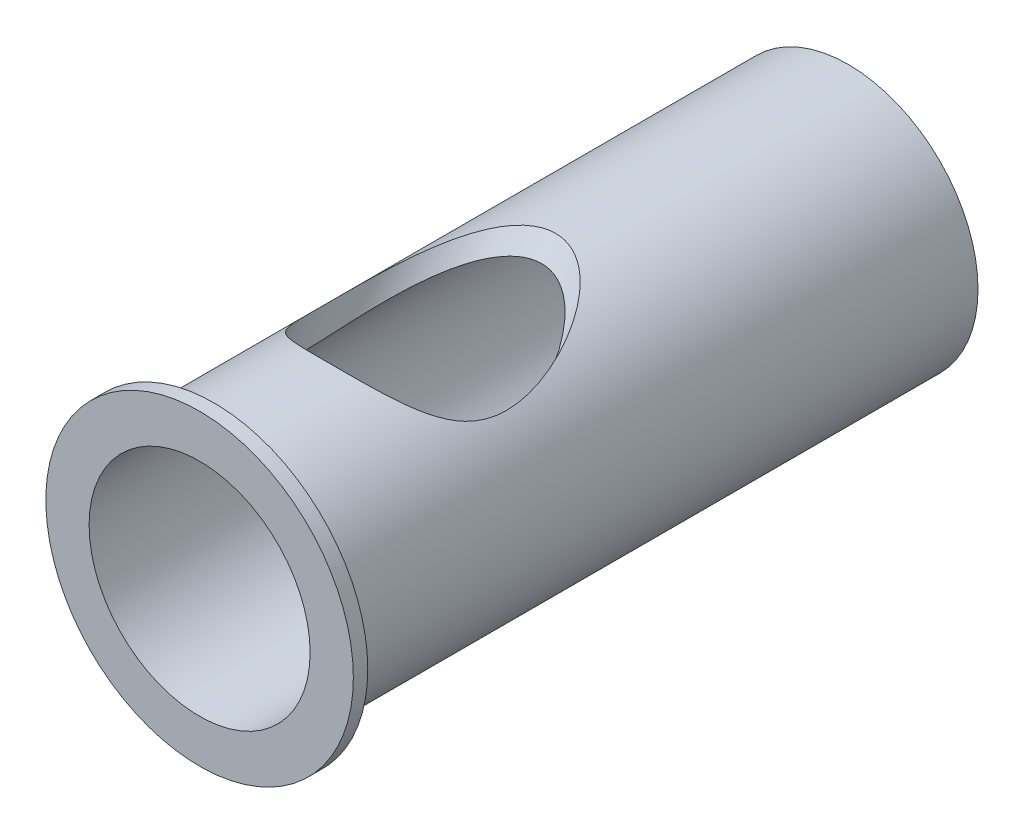
ISO-10303-21;
HEADER;
FILE_DESCRIPTION(('STEP AP214'),'2;1');
FILE_NAME('part.step','',(''),(''),'','','');
FILE_SCHEMA(('AUTOMOTIVE_DESIGN { 1 0 10303 214 1 1 1 1 }'));
ENDSEC;
DATA;
#1=APPLICATION_CONTEXT('core data for automotive mechanical design processes');
#2=APPLICATION_PROTOCOL_DEFINITION('international standard','automotive_design',2000,#1);
#3=PRODUCT_CONTEXT('',#1,'mechanical');
#4=PRODUCT('Part','Part','',(#3));
#5=PRODUCT_RELATED_PRODUCT_CATEGORY('part','',(#4));
#6=PRODUCT_DEFINITION_FORMATION('','',#4);
#7=PRODUCT_DEFINITION_CONTEXT('part definition',#1,'design');
#8=PRODUCT_DEFINITION('design','',#6,#7);
#9=PRODUCT_DEFINITION_SHAPE('','',#8);
#10=(LENGTH_UNIT() NAMED_UNIT(*) SI_UNIT(.MILLI.,.METRE.));
#11=(NAMED_UNIT(*) PLANE_ANGLE_UNIT() SI_UNIT($,.RADIAN.));
#12=(NAMED_UNIT(*) SI_UNIT($,.STERADIAN.) SOLID_ANGLE_UNIT());
#13=UNCERTAINTY_MEASURE_WITH_UNIT(LENGTH_MEASURE(1.E-05),#10,'distance_accuracy_value','');
#14=(GEOMETRIC_REPRESENTATION_CONTEXT(3) GLOBAL_UNCERTAINTY_ASSIGNED_CONTEXT((#13)) GLOBAL_UNIT_ASSIGNED_CONTEXT((#10,
#11,#12)) REPRESENTATION_CONTEXT('',''));
#15=CARTESIAN_POINT('',(0.,0.,0.));
#16=DIRECTION('',(0.,0.,1.));
#17=DIRECTION('',(1.,0.,0.));
#18=AXIS2_PLACEMENT_3D('',#15,#16,#17);
#19=CARTESIAN_POINT('',(0.,0.,0.));
#20=DIRECTION('',(0.,0.,1.));
#21=DIRECTION('',(1.,0.,0.));
#22=AXIS2_PLACEMENT_3D('',#19,#20,#21);
#23=PLANE('',#22);
#24=CARTESIAN_POINT('',(0.,0.,0.));
#25=DIRECTION('',(0.,0.,1.));
#26=DIRECTION('',(1.,0.,0.));
#27=AXIS2_PLACEMENT_3D('',#24,#25,#26);
#28=CIRCLE('',#27,8.);
#29=CARTESIAN_POINT('',(8.,0.,0.));
#30=VERTEX_POINT('',#29);
#31=EDGE_CURVE('E45',#30,#30,#28,.T.);
#32=ORIENTED_EDGE('',*,*,#31,.F.);
#33=EDGE_LOOP('',(#32));
#34=FACE_BOUND('',#33,.T.);
#35=CARTESIAN_POINT('',(0.,0.,0.));
#36=DIRECTION('',(0.,0.,1.));
#37=DIRECTION('',(1.,0.,0.));
#38=AXIS2_PLACEMENT_3D('',#35,#36,#37);
#39=CIRCLE('',#38,6.75);
#40=CARTESIAN_POINT('',(6.75,0.,0.));
#41=VERTEX_POINT('',#40);
#42=EDGE_CURVE('E10',#41,#41,#39,.F.);
#43=ORIENTED_EDGE('',*,*,#42,.F.);
#44=EDGE_LOOP('',(#43));
#45=FACE_BOUND('',#44,.T.);
#46=ADVANCED_FACE('F29',(#34,#45),#23,.F.);
#47=CARTESIAN_POINT('',(0.,0.,0.75));
#48=DIRECTION('',(0.,0.,1.));
#49=DIRECTION('',(1.,0.,0.));
#50=AXIS2_PLACEMENT_3D('',#47,#48,#49);
#51=PLANE('',#50);
#52=CARTESIAN_POINT('',(0.,0.,0.75));
#53=DIRECTION('',(0.,0.,1.));
#54=DIRECTION('',(1.,0.,0.));
#55=AXIS2_PLACEMENT_3D('',#52,#53,#54);
#56=CIRCLE('',#55,8.);
#57=CARTESIAN_POINT('',(8.,0.,0.75));
#58=VERTEX_POINT('',#57);
#59=EDGE_CURVE('E41',#58,#58,#56,.T.);
#60=ORIENTED_EDGE('',*,*,#59,.T.);
#61=EDGE_LOOP('',(#60));
#62=FACE_BOUND('',#61,.T.);
#63=CARTESIAN_POINT('',(0.,0.,0.75));
#64=DIRECTION('',(0.,0.,1.));
#65=DIRECTION('',(1.,0.,0.));
#66=AXIS2_PLACEMENT_3D('',#63,#64,#65);
#67=CIRCLE('',#66,5.75);
#68=CARTESIAN_POINT('',(5.75,0.,0.75));
#69=VERTEX_POINT('',#68);
#70=EDGE_CURVE('E49',#69,#69,#67,.T.);
#71=ORIENTED_EDGE('',*,*,#70,.F.);
#72=EDGE_LOOP('',(#71));
#73=FACE_BOUND('',#72,.T.);
#74=ADVANCED_FACE('F83',(#62,#73),#51,.T.);
#75=CARTESIAN_POINT('',(0.,0.,0.75));
#76=DIRECTION('',(0.,0.,-1.));
#77=DIRECTION('',(-1.,0.,0.));
#78=AXIS2_PLACEMENT_3D('',#75,#76,#77);
#79=CYLINDRICAL_SURFACE('',#78,8.);
#80=ORIENTED_EDGE('',*,*,#59,.F.);
#81=EDGE_LOOP('',(#80));
#82=FACE_BOUND('',#81,.T.);
#83=ORIENTED_EDGE('',*,*,#31,.T.);
#84=EDGE_LOOP('',(#83));
#85=FACE_BOUND('',#84,.T.);
#86=ADVANCED_FACE('F31',(#82,#85),#79,.T.);
#87=CARTESIAN_POINT('',(0.,0.,0.75));
#88=DIRECTION('',(0.,0.,-1.));
#89=DIRECTION('',(-1.,0.,0.));
#90=AXIS2_PLACEMENT_3D('',#87,#88,#89);
#91=CYLINDRICAL_SURFACE('',#90,5.75);
#92=CARTESIAN_POINT('',(0.,5.75,-5.30629664290703));
#93=CARTESIAN_POINT('',(0.130680412431029,5.75000288558465,-5.30629572991546));
#94=CARTESIAN_POINT('',(0.261331233982429,5.74554114326279,-5.30972559956274));
#95=CARTESIAN_POINT('',(0.52170846593303,5.72776913861366,-5.32343374443545));
#96=CARTESIAN_POINT('',(0.651434691685461,5.71445715626851,-5.33371335088777));
#97=CARTESIAN_POINT('',(0.909038175413375,5.67917810389533,-5.36110145547959));
#98=CARTESIAN_POINT('',(1.03691444044914,5.6572065525103,-5.37821348948404));
#99=CARTESIAN_POINT('',(1.28989545146572,5.60494047762857,-5.41923366483618));
#100=CARTESIAN_POINT('',(1.41499911588225,5.57464276585176,-5.4431444096899));
#101=CARTESIAN_POINT('',(1.66122264238964,5.50628047140044,-5.4976518479393));
#102=CARTESIAN_POINT('',(1.78235158450518,5.46823526545043,-5.52823187453841));
#103=CARTESIAN_POINT('',(2.02021637369789,5.38489685972274,-5.5961034203329));
#104=CARTESIAN_POINT('',(2.13695020177727,5.33960037789276,-5.63339797959878));
#105=CARTESIAN_POINT('',(2.36529214235244,5.2424511188252,-5.71471703775265));
#106=CARTESIAN_POINT('',(2.47689805363255,5.19059556122124,-5.75874439230992));
#107=CARTESIAN_POINT('',(2.69422193368248,5.0811870532787,-5.85356338597342));
#108=CARTESIAN_POINT('',(2.79994233049067,5.02363648001691,-5.90435220590232));
#109=CARTESIAN_POINT('',(3.00793300534078,4.90201694767191,-6.01443992883657));
#110=CARTESIAN_POINT('',(3.11001205655151,4.83780660958394,-6.07394421851287));
#111=CARTESIAN_POINT('',(3.30666813153573,4.70557933927185,-6.20052920839255));
#112=CARTESIAN_POINT('',(3.40124811282812,4.63756392594397,-6.26760689620819));
#113=CARTESIAN_POINT('',(3.58230964182943,4.49917078009174,-6.40973506064474));
#114=CARTESIAN_POINT('',(3.66879306762416,4.4287936005762,-6.48478367965561));
#115=CARTESIAN_POINT('',(3.83302695209899,4.28743817721743,-6.64337101816204));
#116=CARTESIAN_POINT('',(3.91078066639039,4.21646016813538,-6.72690655030619));
#117=CARTESIAN_POINT('',(4.03597383346852,4.09617610133763,-6.87782996839516));
#118=CARTESIAN_POINT('',(4.0857219246373,4.04647931685547,-6.94300031075999));
#119=CARTESIAN_POINT('',(4.18016023598269,3.94884382293843,-7.07813473047429));
#120=CARTESIAN_POINT('',(4.22485188403518,3.90090461978247,-7.14809744551377));
#121=CARTESIAN_POINT('',(4.30885176890441,3.80791513214527,-7.29280334242662));
#122=CARTESIAN_POINT('',(4.34816922806994,3.7628599710216,-7.36753800357677));
#123=CARTESIAN_POINT('',(4.42125781159588,3.6767065083357,-7.5218034999211));
#124=CARTESIAN_POINT('',(4.45503185990169,3.63560612553769,-7.6013317761956));
#125=CARTESIAN_POINT('',(4.51719720216576,3.5580790197996,-7.76574225129305));
#126=CARTESIAN_POINT('',(4.54553240052937,3.52170213750884,-7.85066934400973));
#127=CARTESIAN_POINT('',(4.59636267749919,3.45509902051374,-8.02458508512187));
#128=CARTESIAN_POINT('',(4.61885821717372,3.42487230026614,-8.11357341221118));
#129=CARTESIAN_POINT('',(4.65815186527345,3.37123569845208,-8.29480062661039));
#130=CARTESIAN_POINT('',(4.67494992189361,3.34782587886938,-8.38703954346824));
#131=CARTESIAN_POINT('',(4.70317477196393,3.30805702767188,-8.57383583467173));
#132=CARTESIAN_POINT('',(4.71460025927121,3.29169971069425,-8.66839376692803));
#133=CARTESIAN_POINT('',(4.73384615981668,3.26397469588583,-8.87280217180147));
#134=CARTESIAN_POINT('',(4.74089667974343,3.25368416460023,-8.98286974634207));
#135=CARTESIAN_POINT('',(4.7493345415213,3.24135327677586,-9.2036639522311));
#136=CARTESIAN_POINT('',(4.75072041920688,3.23931505324946,-9.31439074656556));
#137=CARTESIAN_POINT('',(4.74859374875228,3.24243087836585,-9.53597156849909));
#138=CARTESIAN_POINT('',(4.74506763389541,3.24760484680504,-9.64682510018232));
#139=CARTESIAN_POINT('',(4.7337521956935,3.26407501600456,-9.8678725084329));
#140=CARTESIAN_POINT('',(4.72596103507189,3.27537385518772,-9.97806608001));
#141=CARTESIAN_POINT('',(4.69762700083368,3.31600259940603,-10.3002217865313));
#142=CARTESIAN_POINT('',(4.67197507335949,3.35230944684711,-10.5108567425406));
#143=CARTESIAN_POINT('',(4.60931128875608,3.43795736909389,-10.9277640389658));
#144=CARTESIAN_POINT('',(4.57228754742909,3.48731207210589,-11.1340315729747));
#145=CARTESIAN_POINT('',(4.48802458947355,3.59511294126111,-11.5427287772699));
#146=CARTESIAN_POINT('',(4.44075390531911,3.65358695331231,-11.7451444882925));
#147=CARTESIAN_POINT('',(4.33659661346578,3.77662958992441,-12.1454625108723));
#148=CARTESIAN_POINT('',(4.27971415587862,3.8411955788384,-12.3433667286963));
#149=CARTESIAN_POINT('',(4.14565473621482,3.98589883432853,-12.7685059600345));
#150=CARTESIAN_POINT('',(4.06666959276473,4.06680102467571,-12.994912346085));
#151=CARTESIAN_POINT('',(3.89469657238967,4.23179215758126,-13.4412856198576));
#152=CARTESIAN_POINT('',(3.80170281120609,4.31588242811844,-13.6612497549443));
#153=CARTESIAN_POINT('',(3.60080058472556,4.48485297561016,-14.0927010659054));
#154=CARTESIAN_POINT('',(3.49295776536348,4.56972832060321,-14.3042205388836));
#155=CARTESIAN_POINT('',(3.26012317796769,4.73864950441791,-14.7178196352207));
#156=CARTESIAN_POINT('',(3.13514549256885,4.82269596429113,-14.9199068297288));
#157=CARTESIAN_POINT('',(2.88426715262977,4.97613923485673,-15.2840243113633));
#158=CARTESIAN_POINT('',(2.7609889104478,5.04592881595251,-15.4476813661887));
#159=CARTESIAN_POINT('',(2.49721844902559,5.18154669950428,-15.7629024491151));
#160=CARTESIAN_POINT('',(2.35670454881337,5.24736985415113,-15.9144508417453));
#161=CARTESIAN_POINT('',(2.05449655274468,5.37295541302685,-16.2016428769961));
#162=CARTESIAN_POINT('',(1.89259999625098,5.43264872784017,-16.3371074425726));
#163=CARTESIAN_POINT('',(1.54670121270095,5.54101102705591,-16.5818157266376));
#164=CARTESIAN_POINT('',(1.36276386646168,5.58971120783031,-16.6911336980347));
#165=CARTESIAN_POINT('',(1.03994209659998,5.65669257063893,-16.841042413154));
#166=CARTESIAN_POINT('',(0.907056619760613,5.67968463951215,-16.892359443651));
#167=CARTESIAN_POINT('',(0.633911523844421,5.71660499093457,-16.974664335593));
#168=CARTESIAN_POINT('',(0.493660535602266,5.73054363689651,-17.0056754414707));
#169=CARTESIAN_POINT('',(0.208382489289948,5.7480074888,-17.0445181363331));
#170=CARTESIAN_POINT('',(0.0633315604899354,5.75146880785028,-17.0522075185742));
#171=CARTESIAN_POINT('',(-0.225856681648289,5.74738268212758,-17.0431243511025));
#172=CARTESIAN_POINT('',(-0.369993812889518,5.73983310837626,-17.0263470707112));
#173=CARTESIAN_POINT('',(-0.642265112413987,5.71553387457657,-16.9722653440582));
#174=CARTESIAN_POINT('',(-0.770794973236055,5.6995048694623,-16.9365684509106));
#175=CARTESIAN_POINT('',(-1.02078570947491,5.6600830933449,-16.8485957812161));
#176=CARTESIAN_POINT('',(-1.14224307340166,5.63668670076058,-16.7963118508969));
#177=CARTESIAN_POINT('',(-1.44740365181283,5.56817632676458,-16.642799840614));
#178=CARTESIAN_POINT('',(-1.62474270687961,5.51845350531003,-16.5310253417619));
#179=CARTESIAN_POINT('',(-1.95844945593745,5.40906839421514,-16.2836267310671));
#180=CARTESIAN_POINT('',(-2.11475819982849,5.34937917449253,-16.1479379440102));
#181=CARTESIAN_POINT('',(-2.38905848410475,5.23202399265864,-15.8790860928386));
#182=CARTESIAN_POINT('',(-2.50938644083059,5.17512099065705,-15.747929640064));
#183=CARTESIAN_POINT('',(-2.7374207285188,5.0582076260609,-15.4762569261138));
#184=CARTESIAN_POINT('',(-2.84511689985174,4.99819481745165,-15.3357332715149));
#185=CARTESIAN_POINT('',(-3.04960467337991,4.87612833218239,-15.047068764655));
#186=CARTESIAN_POINT('',(-3.14635772623487,4.81406837823978,-14.8989035074537));
#187=CARTESIAN_POINT('',(-3.32980685282554,4.68905175962855,-14.596793858719));
#188=CARTESIAN_POINT('',(-3.41649940839957,4.6260947898626,-14.4428474702813));
#189=CARTESIAN_POINT('',(-3.5712397564736,4.50745039730401,-14.1483572156136));
#190=CARTESIAN_POINT('',(-3.64028373103577,4.45176723205067,-14.0083313028822));
#191=CARTESIAN_POINT('',(-3.77179342493114,4.34090654996323,-13.7250259045653));
#192=CARTESIAN_POINT('',(-3.83425885212364,4.28572905568427,-13.5817462748316));
#193=CARTESIAN_POINT('',(-3.95309667310116,4.17636843420906,-13.2920700863316));
#194=CARTESIAN_POINT('',(-4.00946099675733,4.12218670087613,-13.1456696985719));
#195=CARTESIAN_POINT('',(-4.11629749480769,4.0155063959681,-12.8501303150919));
#196=CARTESIAN_POINT('',(-4.16676959789478,3.96300784476829,-12.700991286254));
#197=CARTESIAN_POINT('',(-4.26183164171087,3.86058987066336,-12.4005880078281));
#198=CARTESIAN_POINT('',(-4.30644085494691,3.81066234315163,-12.2493326268876));
#199=CARTESIAN_POINT('',(-4.39001682657518,3.7140717913861,-11.9442121316548));
#200=CARTESIAN_POINT('',(-4.42898288721731,3.66740917119127,-11.7903466972643));
#201=CARTESIAN_POINT('',(-4.50107348936111,3.57856164881695,-11.4802578889711));
#202=CARTESIAN_POINT('',(-4.53420768475783,3.53636939351435,-11.3240388855787));
#203=CARTESIAN_POINT('',(-4.59435660606682,3.4578649480526,-11.0089958194637));
#204=CARTESIAN_POINT('',(-4.62137375646044,3.42155042989434,-10.8501728156941));
#205=CARTESIAN_POINT('',(-4.66081360355726,3.36749743385308,-10.5828875890657));
#206=CARTESIAN_POINT('',(-4.6751079575835,3.34758741472142,-10.4751414316853));
#207=CARTESIAN_POINT('',(-4.70035052131211,3.31205058856966,-10.2585388894503));
#208=CARTESIAN_POINT('',(-4.71129861726725,3.2964239271529,-10.1496824669851));
#209=CARTESIAN_POINT('',(-4.72942105656622,3.27037225052314,-9.93114679829952));
#210=CARTESIAN_POINT('',(-4.7366001542298,3.25994068293188,-9.82146876657204));
#211=CARTESIAN_POINT('',(-4.7466645716656,3.24526416793505,-9.60153666215243));
#212=CARTESIAN_POINT('',(-4.74955054072454,3.24101828501726,-9.49128267909798));
#213=CARTESIAN_POINT('',(-4.75062544547164,3.23947188187376,-9.19523265925857));
#214=CARTESIAN_POINT('',(-4.7442685055199,3.24888320507262,-9.00920014941239));
#215=CARTESIAN_POINT('',(-4.72143560238308,3.28186982009191,-8.73373287718956));
#216=CARTESIAN_POINT('',(-4.7116149242753,3.29600094091668,-8.64254288450935));
#217=CARTESIAN_POINT('',(-4.68711794383429,3.33074943022778,-8.46208550754955));
#218=CARTESIAN_POINT('',(-4.67244402734065,3.35136361141413,-8.37281720149435));
#219=CARTESIAN_POINT('',(-4.6378082493217,3.39913285189623,-8.19648466840373));
#220=CARTESIAN_POINT('',(-4.61781428247746,3.42632752958855,-8.10943746304307));
#221=CARTESIAN_POINT('',(-4.57240113399272,3.48669934826198,-7.93890727983497));
#222=CARTESIAN_POINT('',(-4.54698187676144,3.51987657259714,-7.85542435166819));
#223=CARTESIAN_POINT('',(-4.49065400243404,3.59146209929541,-7.69249053142838));
#224=CARTESIAN_POINT('',(-4.45973641934979,3.62987892152901,-7.61304650176691));
#225=CARTESIAN_POINT('',(-4.39254932691644,3.71090012940404,-7.45867807913104));
#226=CARTESIAN_POINT('',(-4.35627839722203,3.75350562537602,-7.38375489307817));
#227=CARTESIAN_POINT('',(-4.27154504944045,3.84983402320778,-7.22542005310317));
#228=CARTESIAN_POINT('',(-4.22206435225317,3.90417288136101,-7.1429286879573));
#229=CARTESIAN_POINT('',(-4.11630591919981,4.01552289670114,-6.98436656941789));
#230=CARTESIAN_POINT('',(-4.06002667523618,4.07253464508326,-6.90829724698448));
#231=CARTESIAN_POINT('',(-3.94103594248192,4.18779204289411,-6.76226890115946));
#232=CARTESIAN_POINT('',(-3.87831950010545,4.24603861478654,-6.69231466129342));
#233=CARTESIAN_POINT('',(-3.74685253056035,4.36248922136162,-6.55823720500543));
#234=CARTESIAN_POINT('',(-3.67809968106399,4.42069323090961,-6.49411625225465));
#235=CARTESIAN_POINT('',(-3.53325815537709,4.53733796195225,-6.36998339465408));
#236=CARTESIAN_POINT('',(-3.45703493848141,4.59575203137089,-6.31010366735042));
#237=CARTESIAN_POINT('',(-3.29901390712005,4.71047190741745,-6.19586531546387));
#238=CARTESIAN_POINT('',(-3.21721402521332,4.76677692003505,-6.14150875729318));
#239=CARTESIAN_POINT('',(-3.04845750637955,4.87642588262632,-6.03814492353855));
#240=CARTESIAN_POINT('',(-2.96150232933543,4.92977066267642,-5.98913614462502));
#241=CARTESIAN_POINT('',(-2.78279364122767,5.03281252658632,-5.89630263750282));
#242=CARTESIAN_POINT('',(-2.69103987106052,5.08250941312652,-5.85247818964347));
#243=CARTESIAN_POINT('',(-2.48543047393298,5.18659694673788,-5.76214513219211));
#244=CARTESIAN_POINT('',(-2.37066593777444,5.24010981940316,-5.71668449306299));
#245=CARTESIAN_POINT('',(-2.13563209570266,5.34021522454246,-5.63287579775956));
#246=CARTESIAN_POINT('',(-2.01536189978379,5.38680663293747,-5.5945288966394));
#247=CARTESIAN_POINT('',(-1.77018207686676,5.47227513371468,-5.52496232345574));
#248=CARTESIAN_POINT('',(-1.64527507744071,5.51115651829989,-5.4937386843767));
#249=CARTESIAN_POINT('',(-1.39167401164052,5.58059448077076,-5.43842848545845));
#250=CARTESIAN_POINT('',(-1.26298091582348,5.61115317190759,-5.41434011373622));
#251=CARTESIAN_POINT('',(-0.947977974346158,5.67444571484616,-5.36471481953637));
#252=CARTESIAN_POINT('',(-0.760163638167774,5.70270580080767,-5.34281611998895));
#253=CARTESIAN_POINT('',(-0.381545009323126,5.74048000408986,-5.31360834659194));
#254=CARTESIAN_POINT('',(-0.190740984029001,5.74999578820388,-5.3062979755085));
#255=CARTESIAN_POINT('',(0.,5.75,-5.30629664290703));
#256=B_SPLINE_CURVE_WITH_KNOTS('',3,(#92,#93,#94,#95,#96,#97,#98,#99,#100,#101,#102,#103,#104,
#105,#106,#107,#108,#109,#110,#111,#112,#113,#114,#115,#116,#117,#118,#119,#120,#121,#122,#123,
#124,#125,#126,#127,#128,#129,#130,#131,#132,#133,#134,#135,#136,#137,#138,#139,#140,#141,#142,
#143,#144,#145,#146,#147,#148,#149,#150,#151,#152,#153,#154,#155,#156,#157,#158,#159,#160,#161,
#162,#163,#164,#165,#166,#167,#168,#169,#170,#171,#172,#173,#174,#175,#176,#177,#178,#179,#180,
#181,#182,#183,#184,#185,#186,#187,#188,#189,#190,#191,#192,#193,#194,#195,#196,#197,#198,#199,
#200,#201,#202,#203,#204,#205,#206,#207,#208,#209,#210,#211,#212,#213,#214,#215,#216,#217,#218,
#219,#220,#221,#222,#223,#224,#225,#226,#227,#228,#229,#230,#231,#232,#233,#234,#235,#236,#237,
#238,#239,#240,#241,#242,#243,#244,#245,#246,#247,#248,#249,#250,#251,#252,#253,#254,#255),
.UNSPECIFIED.,.T.,.F.,(4,2,2,2,2,2,2,2,2,2,2,2,2,2,2,2,2,2,2,2,2,2,2,2,2,2,2,2,2,2,2,2,2,2,2,2,
2,2,2,2,2,2,2,2,2,2,2,2,2,2,2,2,2,2,2,2,2,2,2,2,2,2,2,2,2,2,2,2,2,2,2,2,2,2,2,2,2,2,2,2,2,4),
(0.,0.391869460653012,0.783815102243745,1.17596384395326,1.56826295826146,1.95959271169122,
2.35110009111615,2.74277398867145,3.13428508719791,3.53724221381496,3.94003962151909,
4.34274336319112,4.74529642032848,5.03268243475521,5.31998709136157,5.60679235875018,
5.89344585733699,6.18291334666413,6.47235797422516,6.76180523352566,7.05132282495947,
7.3831102687789,7.71498346577001,8.04777510212947,8.38071020986209,9.02540761065986,
9.67078106290044,10.3181652134654,10.9652705514569,11.7239899672888,12.4830289731595,
13.238814098394,13.9939817489306,14.6425123458301,15.2918672694724,15.9478825656252,
16.6020121356651,17.0332986982715,17.4640906949232,17.8975042643779,18.3310016463316,
18.732482955172,19.1341619287784,19.776785827952,20.4211751194866,20.9809754443063,
21.54122296802,22.1033863484702,22.6657457291227,23.1628426126803,23.6599615620596,
24.1577302322135,24.6555049256934,25.1516000681272,25.6477564981895,26.1430837188787,
26.6382142723685,26.9695952238096,27.3009874384219,27.6319606150873,27.9628837307451,
28.5195027513705,28.7975914016862,29.0755435470265,29.3552126882546,29.6348857263775,
29.9150190737564,30.1952268799283,30.5261845092887,30.857215689087,31.1885035432,
31.5199194136496,31.8591330523702,32.1984731391507,32.537717585968,32.8769803694838,
33.280114538057,33.6833141061466,34.0862885772378,34.4891606317371,35.0611837269487,
35.6331559540437),.UNSPECIFIED.);
#257=CARTESIAN_POINT('',(0.,5.75,-5.30629664290703));
#258=VERTEX_POINT('',#257);
#259=EDGE_CURVE('E59',#258,#258,#256,.T.);
#260=ORIENTED_EDGE('',*,*,#259,.T.);
#261=EDGE_LOOP('',(#260));
#262=FACE_BOUND('',#261,.T.);
#263=ORIENTED_EDGE('',*,*,#70,.T.);
#264=EDGE_LOOP('',(#263));
#265=FACE_BOUND('',#264,.T.);
#266=CARTESIAN_POINT('',(0.,0.,-33.));
#267=DIRECTION('',(0.,0.,-1.));
#268=DIRECTION('',(-1.,0.,0.));
#269=AXIS2_PLACEMENT_3D('',#266,#267,#268);
#270=CIRCLE('',#269,5.75);
#271=CARTESIAN_POINT('',(-5.75,0.,-33.));
#272=VERTEX_POINT('',#271);
#273=EDGE_CURVE('E54',#272,#272,#270,.T.);
#274=ORIENTED_EDGE('',*,*,#273,.T.);
#275=EDGE_LOOP('',(#274));
#276=FACE_BOUND('',#275,.T.);
#277=ADVANCED_FACE('F78',(#262,#265,#276),#91,.F.);
#278=CARTESIAN_POINT('',(0.,0.,-52.0918830920368));
#279=DIRECTION('',(0.,0.,1.));
#280=DIRECTION('',(1.,0.,0.));
#281=AXIS2_PLACEMENT_3D('',#278,#279,#280);
#282=CYLINDRICAL_SURFACE('',#281,6.75);
#283=CARTESIAN_POINT('',(0.,6.75000000000001,-6.03283917091244));
#284=CARTESIAN_POINT('',(-0.132980272968062,6.74999897722519,-6.03283943755118));
#285=CARTESIAN_POINT('',(-0.265997946841911,6.74606271632772,-6.03688811859303));
#286=CARTESIAN_POINT('',(-0.531132673804768,6.73038276417858,-6.05308771671702));
#287=CARTESIAN_POINT('',(-0.663249165370251,6.71863458726957,-6.06524328884521));
#288=CARTESIAN_POINT('',(-0.925857048648929,6.68751107446156,-6.09769518816824));
#289=CARTESIAN_POINT('',(-1.05634449837263,6.66811995908361,-6.11800835905019));
#290=CARTESIAN_POINT('',(-1.31448659991508,6.62207040462237,-6.16678298753358));
#291=CARTESIAN_POINT('',(-1.44214113173236,6.59541165831765,-6.19524478960112));
#292=CARTESIAN_POINT('',(-1.69352431370203,6.5353766750806,-6.26028522333213));
#293=CARTESIAN_POINT('',(-1.81725878162797,6.50201099013435,-6.29685111403644));
#294=CARTESIAN_POINT('',(-2.06016289948144,6.42917615980949,-6.37816838907133));
#295=CARTESIAN_POINT('',(-2.17933236520867,6.38970676846604,-6.42292010328442));
#296=CARTESIAN_POINT('',(-2.41228554260765,6.30545156116341,-6.52067950502749));
#297=CARTESIAN_POINT('',(-2.52606924003017,6.26066573113952,-6.57368721439893));
#298=CARTESIAN_POINT('',(-2.7474582236756,6.16671967729086,-6.68806028057173));
#299=CARTESIAN_POINT('',(-2.85506382609481,6.11755967766601,-6.74942520910569));
#300=CARTESIAN_POINT('',(-3.06380654760786,6.01574052304519,-6.88094406047504));
#301=CARTESIAN_POINT('',(-3.1649123457441,5.96306660346223,-6.95113632854201));
#302=CARTESIAN_POINT('',(-3.35936083152287,5.85572603828062,-7.10023706765641));
#303=CARTESIAN_POINT('',(-3.45270328522636,5.80105933270311,-7.17914580119734));
#304=CARTESIAN_POINT('',(-3.63079340964433,5.69128919053234,-7.34571864175843));
#305=CARTESIAN_POINT('',(-3.71554777886001,5.63618613102388,-7.43337581760304));
#306=CARTESIAN_POINT('',(-3.87580147578432,5.52721014853883,-7.61748414598965));
#307=CARTESIAN_POINT('',(-3.95130197987789,5.4733370699126,-7.71393417802782));
#308=CARTESIAN_POINT('',(-4.08715102144554,5.37255222024119,-7.90792663565363));
#309=CARTESIAN_POINT('',(-4.148207848719,5.32542044588848,-8.00485818422643));
#310=CARTESIAN_POINT('',(-4.26139287248061,5.23529050146696,-8.20561554434448));
#311=CARTESIAN_POINT('',(-4.31352189698253,5.19229194822285,-8.30944071529632));
#312=CARTESIAN_POINT('',(-4.40854875458826,5.11185690174294,-8.52312325669848));
#313=CARTESIAN_POINT('',(-4.45145816347584,5.07441345224908,-8.63297284290114));
#314=CARTESIAN_POINT('',(-4.52812992425046,5.00611221898332,-8.85775216862763));
#315=CARTESIAN_POINT('',(-4.56189303541143,4.97525388859722,-8.97268148553904));
#316=CARTESIAN_POINT('',(-4.6416783018987,4.90124456914926,-9.29077129074772));
#317=CARTESIAN_POINT('',(-4.67901489261016,4.86524802785158,-9.49785914200931));
#318=CARTESIAN_POINT('',(-4.73035581699494,4.81533784252063,-9.91736145240518));
#319=CARTESIAN_POINT('',(-4.74434283311091,4.80144058911309,-10.1297797465336));
#320=CARTESIAN_POINT('',(-4.75199108061666,4.79385396529957,-10.5125591999754));
#321=CARTESIAN_POINT('',(-4.7491599097794,4.79667699765247,-10.6828294530802));
#322=CARTESIAN_POINT('',(-4.73278997288178,4.8128300879671,-11.0224098653889));
#323=CARTESIAN_POINT('',(-4.71924464562503,4.82616658420715,-11.1917193722362));
#324=CARTESIAN_POINT('',(-4.68277125823957,4.86156260644335,-11.5290147661695));
#325=CARTESIAN_POINT('',(-4.6598072919221,4.88365550304104,-11.6969930524169));
#326=CARTESIAN_POINT('',(-4.6055111936799,4.93489191369181,-12.0305382541889));
#327=CARTESIAN_POINT('',(-4.57417599749281,4.96403800917754,-12.1961042632571));
#328=CARTESIAN_POINT('',(-4.50979040192239,5.02253395936516,-12.4966266771085));
#329=CARTESIAN_POINT('',(-4.47793176679607,5.05101127347579,-12.6320130655283));
#330=CARTESIAN_POINT('',(-4.40914958463313,5.11116295524307,-12.9007807566684));
#331=CARTESIAN_POINT('',(-4.37222538731963,5.14283773322674,-13.0341617995152));
#332=CARTESIAN_POINT('',(-4.25402125012982,5.24179132746798,-13.4313212076292));
#333=CARTESIAN_POINT('',(-4.16534108071263,5.31296994688206,-13.6919711004596));
#334=CARTESIAN_POINT('',(-3.96843869053441,5.46161248467535,-14.2032411579495));
#335=CARTESIAN_POINT('',(-3.86025467738246,5.53906395413475,-14.4538797821893));
#336=CARTESIAN_POINT('',(-3.62291277402983,5.69713668539617,-14.9438330491537));
#337=CARTESIAN_POINT('',(-3.49377482723982,5.777754878431,-15.1831581827833));
#338=CARTESIAN_POINT('',(-3.28344396857389,5.89812393813879,-15.5296617144712));
#339=CARTESIAN_POINT('',(-3.21115643672375,5.93786248632064,-15.6422952722395));
#340=CARTESIAN_POINT('',(-3.06042840794585,6.01693669785779,-15.8634991870478));
#341=CARTESIAN_POINT('',(-2.98198933151794,6.0562724518673,-15.9720704736343));
#342=CARTESIAN_POINT('',(-2.81850383958628,6.13406302225021,-16.1843848790553));
#343=CARTESIAN_POINT('',(-2.73346082970984,6.17251827961694,-16.2881304429367));
#344=CARTESIAN_POINT('',(-2.5562156362351,6.24800195474365,-16.4898310679115));
#345=CARTESIAN_POINT('',(-2.46401478188911,6.285030635525,-16.5877871982127));
#346=CARTESIAN_POINT('',(-2.21467760480432,6.37844530714711,-16.8329066189552));
#347=CARTESIAN_POINT('',(-2.05152362230597,6.43325221524342,-16.9747030491598));
#348=CARTESIAN_POINT('',(-1.70364433311676,6.53396469025597,-17.2328600083502));
#349=CARTESIAN_POINT('',(-1.51896361850562,6.57988815176244,-17.3492717331768));
#350=CARTESIAN_POINT('',(-1.18570094159439,6.64653295052691,-17.5172183096753));
#351=CARTESIAN_POINT('',(-1.04239872631134,6.6706959788844,-17.5777681610625));
#352=CARTESIAN_POINT('',(-0.747090057134337,6.71017581922356,-17.6764409935034));
#353=CARTESIAN_POINT('',(-0.595094017685558,6.72550298157013,-17.7145902157106));
#354=CARTESIAN_POINT('',(-0.284971420278643,6.74578074787782,-17.7650205530131));
#355=CARTESIAN_POINT('',(-0.126809381626722,6.75065792554588,-17.7771186239442));
#356=CARTESIAN_POINT('',(0.189150753992848,6.74919813121263,-17.7734938692675));
#357=CARTESIAN_POINT('',(0.346948837129835,6.74286073985463,-17.7577700032884));
#358=CARTESIAN_POINT('',(0.642250966688467,6.72085641415749,-17.7030198246696));
#359=CARTESIAN_POINT('',(0.780271887146096,6.70611845713934,-17.6663129024859));
#360=CARTESIAN_POINT('',(1.04894600101108,6.66938011104753,-17.5744649444771));
#361=CARTESIAN_POINT('',(1.17959556656543,6.64737618186761,-17.5193149226904));
#362=CARTESIAN_POINT('',(1.502329851364,6.58373881272515,-17.3590145885052));
#363=CARTESIAN_POINT('',(1.68823542895973,6.53799061071932,-17.2431060427922));
#364=CARTESIAN_POINT('',(2.0384634126153,6.43743681021512,-16.9854974793784));
#365=CARTESIAN_POINT('',(2.20272683677569,6.38260734307518,-16.8437293918228));
#366=CARTESIAN_POINT('',(2.48658782319061,6.27681785739118,-16.5663135119512));
#367=CARTESIAN_POINT('',(2.6091262828324,6.22664322082615,-16.4333182015548));
#368=CARTESIAN_POINT('',(2.84161694005231,6.12404090434268,-16.1574615866384));
#369=CARTESIAN_POINT('',(2.95156007303633,6.07161163867495,-16.0145932938213));
#370=CARTESIAN_POINT('',(3.16034827164804,5.96560466984478,-15.7207127585178));
#371=CARTESIAN_POINT('',(3.25915815114869,5.91202392958641,-15.5696768119616));
#372=CARTESIAN_POINT('',(3.44636622216662,5.8048844888525,-15.2612540233218));
#373=CARTESIAN_POINT('',(3.53476122110801,5.75132580012432,-15.1038652535918));
#374=CARTESIAN_POINT('',(3.74639187784763,5.6169459426923,-14.6986771119811));
#375=CARTESIAN_POINT('',(3.86317539867174,5.53676420112079,-14.4472843707351));
#376=CARTESIAN_POINT('',(4.07618835079746,5.38186681067204,-13.9340626582958));
#377=CARTESIAN_POINT('',(4.17239997696801,5.30715593334255,-13.672224877516));
#378=CARTESIAN_POINT('',(4.30145092224847,5.20221867517524,-13.273116038492));
#379=CARTESIAN_POINT('',(4.34188454196913,5.16846359360036,-13.139183667214));
#380=CARTESIAN_POINT('',(4.41763863252079,5.1038659258983,-12.8691939360062));
#381=CARTESIAN_POINT('',(4.4529597938989,5.07302294662531,-12.7331368658181));
#382=CARTESIAN_POINT('',(4.51828332115194,5.01493011498429,-12.4591342608863));
#383=CARTESIAN_POINT('',(4.54829083495264,4.98767679154662,-12.3211906949615));
#384=CARTESIAN_POINT('',(4.60271429414656,4.93749852830483,-12.0434450691686));
#385=CARTESIAN_POINT('',(4.6271315369559,4.9145725843996,-11.9036434485117));
#386=CARTESIAN_POINT('',(4.66828394610543,4.87548645455717,-11.6331150637497));
#387=CARTESIAN_POINT('',(4.68546388684762,4.85894286362289,-11.5025122001958));
#388=CARTESIAN_POINT('',(4.71416997279189,4.83109755462893,-11.2401183852485));
#389=CARTESIAN_POINT('',(4.72569639185505,4.81979558266251,-11.1083274917194));
#390=CARTESIAN_POINT('',(4.74244492643035,4.80331721783158,-10.8441521056777));
#391=CARTESIAN_POINT('',(4.74767695632258,4.79813119191016,-10.711768877212));
#392=CARTESIAN_POINT('',(4.75109326345811,4.79474972629868,-10.4468048808105));
#393=CARTESIAN_POINT('',(4.74927855335002,4.79655328217383,-10.3142241439947));
#394=CARTESIAN_POINT('',(4.73856872165667,4.80713125750225,-10.0691527623022));
#395=CARTESIAN_POINT('',(4.73075230412969,4.81484329775371,-9.95657051426178));
#396=CARTESIAN_POINT('',(4.70877811240861,4.83633619083417,-9.73261798555747));
#397=CARTESIAN_POINT('',(4.69462195646525,4.85011549494788,-9.62124740303584));
#398=CARTESIAN_POINT('',(4.65944166343171,4.88392240282425,-9.40060160353204));
#399=CARTESIAN_POINT('',(4.63842104544967,4.90394680476357,-9.29132534320836));
#400=CARTESIAN_POINT('',(4.58908585254421,4.95014455208081,-9.07580384088541));
#401=CARTESIAN_POINT('',(4.56077471129582,4.97631500229673,-8.9695571980976));
#402=CARTESIAN_POINT('',(4.49642860751357,5.03453251687418,-8.76050736812764));
#403=CARTESIAN_POINT('',(4.46035858553292,5.06660615725421,-8.65772234543026));
#404=CARTESIAN_POINT('',(4.38048551623574,5.13581882785771,-8.45697443463031));
#405=CARTESIAN_POINT('',(4.33668224702336,5.17295800342341,-8.359011685));
#406=CARTESIAN_POINT('',(4.24140804589259,5.25135813345821,-8.16851630230332));
#407=CARTESIAN_POINT('',(4.18993089901287,5.29262241978781,-8.07598815610685));
#408=CARTESIAN_POINT('',(4.0795942458263,5.37812984426105,-7.89691623052233));
#409=CARTESIAN_POINT('',(4.02073470670848,5.42237299564381,-7.8103724777345));
#410=CARTESIAN_POINT('',(3.89969106348376,5.51000448341945,-7.64847802146051));
#411=CARTESIAN_POINT('',(3.8379107472231,5.55328807371779,-7.57276793094481));
#412=CARTESIAN_POINT('',(3.70848950411535,5.64054251558081,-7.42695595058801));
#413=CARTESIAN_POINT('',(3.64084667396698,5.6845135865143,-7.35685589639384));
#414=CARTESIAN_POINT('',(3.42967983139866,5.8161113185288,-7.1550225523524));
#415=CARTESIAN_POINT('',(3.27782457593772,5.90349176565128,-7.03163317833385));
#416=CARTESIAN_POINT('',(3.02471690841594,6.03526526086528,-6.85531425891973));
#417=CARTESIAN_POINT('',(2.92972579791813,6.08200935421105,-6.79487607636811));
#418=CARTESIAN_POINT('',(2.73416088124064,6.17239343342406,-6.68103831071575));
#419=CARTESIAN_POINT('',(2.63358666790384,6.21603319237168,-6.62763924191498));
#420=CARTESIAN_POINT('',(2.42739020414812,6.29941778376938,-6.52777264536788));
#421=CARTESIAN_POINT('',(2.32176354489908,6.33915911864185,-6.48131132284575));
#422=CARTESIAN_POINT('',(2.10614835259818,6.41402072906586,-6.39529638131803));
#423=CARTESIAN_POINT('',(1.99615974480454,6.44914092538985,-6.35574288074044));
#424=CARTESIAN_POINT('',(1.76239579988879,6.51709866893858,-6.28024754486522));
#425=CARTESIAN_POINT('',(1.63826962885962,6.54944764688624,-6.24494946803344));
#426=CARTESIAN_POINT('',(1.3864815026004,6.60733313695833,-6.18247414602912));
#427=CARTESIAN_POINT('',(1.25882069357946,6.63287182960604,-6.15529430121826));
#428=CARTESIAN_POINT('',(1.00105630991792,6.67663439640529,-6.10906527129529));
#429=CARTESIAN_POINT('',(0.870957700218198,6.69487173761904,-6.09000111295817));
#430=CARTESIAN_POINT('',(0.609055640412872,6.72375563357051,-6.0599335547331));
#431=CARTESIAN_POINT('',(0.477253229690681,6.73440661260325,-6.04892545652364));
#432=CARTESIAN_POINT('',(0.287662253258683,6.74411308398934,-6.03890633861565));
#433=CARTESIAN_POINT('',(0.230177667316538,6.74631968649165,-6.03663131212212));
#434=CARTESIAN_POINT('',(0.115131057306958,6.74926336444393,-6.03359767204049));
#435=CARTESIAN_POINT('',(0.057569033391495,6.75000044277364,-6.03283905548078));
#436=CARTESIAN_POINT('',(0.,6.75000000000001,-6.03283917091244));
#437=B_SPLINE_CURVE_WITH_KNOTS('',3,(#283,#284,#285,#286,#287,#288,#289,#290,#291,#292,#293,
#294,#295,#296,#297,#298,#299,#300,#301,#302,#303,#304,#305,#306,#307,#308,#309,#310,#311,#312,
#313,#314,#315,#316,#317,#318,#319,#320,#321,#322,#323,#324,#325,#326,#327,#328,#329,#330,#331,
#332,#333,#334,#335,#336,#337,#338,#339,#340,#341,#342,#343,#344,#345,#346,#347,#348,#349,#350,
#351,#352,#353,#354,#355,#356,#357,#358,#359,#360,#361,#362,#363,#364,#365,#366,#367,#368,#369,
#370,#371,#372,#373,#374,#375,#376,#377,#378,#379,#380,#381,#382,#383,#384,#385,#386,#387,#388,
#389,#390,#391,#392,#393,#394,#395,#396,#397,#398,#399,#400,#401,#402,#403,#404,#405,#406,#407,
#408,#409,#410,#411,#412,#413,#414,#415,#416,#417,#418,#419,#420,#421,#422,#423,#424,#425,#426,
#427,#428,#429,#430,#431,#432,#433,#434,#435,#436),.UNSPECIFIED.,.T.,.F.,(4,2,2,2,2,2,2,2,2,2,2,
2,2,2,2,2,2,2,2,2,2,2,2,2,2,2,2,2,2,2,2,2,2,2,2,2,2,2,2,2,2,2,2,2,2,2,2,2,2,2,2,2,2,2,2,2,2,2,2,
2,2,2,2,2,2,2,2,2,2,2,2,2,2,2,2,2,4),(0.,0.398886121118277,0.79800148348017,1.19794520546228,
1.59790583671459,1.99724206924037,2.39659439826146,2.7959477837981,3.19528071208475,
3.59641245169671,3.99755627455507,4.39838476663236,4.79916225096996,5.1702332204879,
5.54126975617449,5.9118376750145,6.28237482196715,6.91979325909015,7.5576842373342,
8.06791380470141,8.57845607150267,9.09096301498158,9.60365781767631,10.0294188885661,
10.4552346665337,11.3073177601239,12.1577494290664,13.0073763765312,13.4260507747438,
13.8446287767415,14.2629923349022,14.6812783855758,15.3482346060797,16.0138330074373,
16.4843923744248,16.9543994005356,17.4276982222211,17.9010147427786,18.3300193641474,
18.7592333130882,19.4268268644342,20.0962037637621,20.6584383062938,21.2210749686501,
21.7854426939068,22.3499829727218,23.2145672908149,24.079896911024,24.5115390092777,
24.9431227504955,25.3742860529201,25.8053491872912,26.203436935505,26.6015053981272,
26.9989460331916,27.3963295563418,27.7353671453853,28.0743182426272,28.4130958466071,
28.7517141847312,29.0918960173666,29.4320876126808,29.7725562362611,30.1130263731043,
30.4333177945379,30.753713592894,31.3940032907074,31.7594293989874,32.1248821916766,
32.4906599177613,32.8564439141398,33.2550913517701,33.6536109964327,34.0513921624788,
34.4489411559268,34.621624915057,34.7943083357895),.UNSPECIFIED.);
#438=CARTESIAN_POINT('',(0.,6.75000000000001,-6.03283917091244));
#439=VERTEX_POINT('',#438);
#440=EDGE_CURVE('E33',#439,#439,#437,.T.);
#441=ORIENTED_EDGE('',*,*,#440,.T.);
#442=EDGE_LOOP('',(#441));
#443=FACE_BOUND('',#442,.T.);
#444=ORIENTED_EDGE('',*,*,#42,.T.);
#445=EDGE_LOOP('',(#444));
#446=FACE_BOUND('',#445,.T.);
#447=CARTESIAN_POINT('',(0.,0.,-33.));
#448=DIRECTION('',(0.,0.,-1.));
#449=DIRECTION('',(-1.,0.,0.));
#450=AXIS2_PLACEMENT_3D('',#447,#448,#449);
#451=CIRCLE('',#450,6.75);
#452=CARTESIAN_POINT('',(-6.75,0.,-33.));
#453=VERTEX_POINT('',#452);
#454=EDGE_CURVE('E53',#453,#453,#451,.T.);
#455=ORIENTED_EDGE('',*,*,#454,.F.);
#456=EDGE_LOOP('',(#455));
#457=FACE_BOUND('',#456,.T.);
#458=ADVANCED_FACE('F73',(#443,#446,#457),#282,.T.);
#459=CARTESIAN_POINT('',(0.,0.,-33.));
#460=DIRECTION('',(0.,0.,-1.));
#461=DIRECTION('',(-1.,0.,0.));
#462=AXIS2_PLACEMENT_3D('',#459,#460,#461);
#463=PLANE('',#462);
#464=ORIENTED_EDGE('',*,*,#273,.F.);
#465=EDGE_LOOP('',(#464));
#466=FACE_BOUND('',#465,.T.);
#467=ORIENTED_EDGE('',*,*,#454,.T.);
#468=EDGE_LOOP('',(#467));
#469=FACE_BOUND('',#468,.T.);
#470=ADVANCED_FACE('F69',(#466,#469),#463,.T.);
#471=CARTESIAN_POINT('',(0.,-8.92254201489874,-0.517393768261112));
#472=DIRECTION('',(0.,0.809016994374931,-0.587785252292496));
#473=DIRECTION('',(0.,0.587785252292496,0.809016994374931));
#474=AXIS2_PLACEMENT_3D('',#471,#472,#473);
#475=CYLINDRICAL_SURFACE('',#474,4.75);
#476=ORIENTED_EDGE('',*,*,#259,.F.);
#477=EDGE_LOOP('',(#476));
#478=FACE_BOUND('',#477,.T.);
#479=ORIENTED_EDGE('',*,*,#440,.F.);
#480=EDGE_LOOP('',(#479));
#481=FACE_BOUND('',#480,.T.);
#482=ADVANCED_FACE('F64',(#478,#481),#475,.F.);
#483=CLOSED_SHELL('',(#46,#74,#86,#277,#458,#470,#482));
#484=MANIFOLD_SOLID_BREP('B2',#483);
#485=ADVANCED_BREP_SHAPE_REPRESENTATION('',(#18,#484),#14);
#486=SHAPE_DEFINITION_REPRESENTATION(#9,#485);
ENDSEC;
END-ISO-10303-21;
